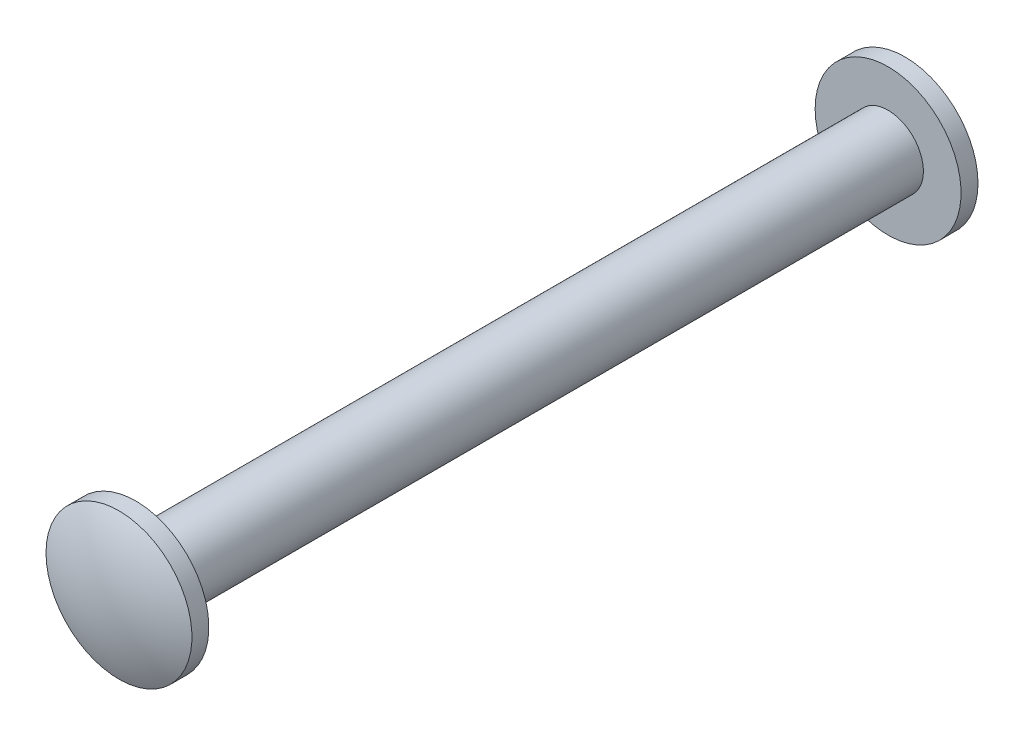
ISO-10303-21;
HEADER;
FILE_DESCRIPTION(('STEP AP214'),'2;1');
FILE_NAME('part.step','',(''),(''),'','','');
FILE_SCHEMA(('AUTOMOTIVE_DESIGN { 1 0 10303 214 1 1 1 1 }'));
ENDSEC;
DATA;
#1=APPLICATION_CONTEXT('core data for automotive mechanical design processes');
#2=APPLICATION_PROTOCOL_DEFINITION('international standard','automotive_design',2000,#1);
#3=PRODUCT_CONTEXT('',#1,'mechanical');
#4=PRODUCT('Part','Part','',(#3));
#5=PRODUCT_RELATED_PRODUCT_CATEGORY('part','',(#4));
#6=PRODUCT_DEFINITION_FORMATION('','',#4);
#7=PRODUCT_DEFINITION_CONTEXT('part definition',#1,'design');
#8=PRODUCT_DEFINITION('design','',#6,#7);
#9=PRODUCT_DEFINITION_SHAPE('','',#8);
#10=(LENGTH_UNIT() NAMED_UNIT(*) SI_UNIT(.MILLI.,.METRE.));
#11=(NAMED_UNIT(*) PLANE_ANGLE_UNIT() SI_UNIT($,.RADIAN.));
#12=(NAMED_UNIT(*) SI_UNIT($,.STERADIAN.) SOLID_ANGLE_UNIT());
#13=UNCERTAINTY_MEASURE_WITH_UNIT(LENGTH_MEASURE(1.E-05),#10,'distance_accuracy_value','');
#14=(GEOMETRIC_REPRESENTATION_CONTEXT(3) GLOBAL_UNCERTAINTY_ASSIGNED_CONTEXT((#13)) GLOBAL_UNIT_ASSIGNED_CONTEXT((#10,
#11,#12)) REPRESENTATION_CONTEXT('',''));
#15=CARTESIAN_POINT('',(0.,0.,0.));
#16=DIRECTION('',(0.,0.,1.));
#17=DIRECTION('',(1.,0.,0.));
#18=AXIS2_PLACEMENT_3D('',#15,#16,#17);
#19=CARTESIAN_POINT('',(0.,0.,-8.24639222222224));
#20=DIRECTION('',(0.,0.,-1.));
#21=DIRECTION('',(1.,0.,0.));
#22=AXIS2_PLACEMENT_3D('',#19,#20,#21);
#23=SPHERICAL_SURFACE('',#22,5.59660777777776);
#24=CARTESIAN_POINT('',(0.,0.,-13.2715));
#25=DIRECTION('',(0.,0.,-1.));
#26=DIRECTION('',(-1.,0.,0.));
#27=AXIS2_PLACEMENT_3D('',#24,#25,#26);
#28=CIRCLE('',#27,2.4638);
#29=CARTESIAN_POINT('',(-2.4638,0.,-13.2715));
#30=VERTEX_POINT('',#29);
#31=EDGE_CURVE('E54',#30,#30,#28,.T.);
#32=ORIENTED_EDGE('',*,*,#31,.T.);
#33=EDGE_LOOP('',(#32));
#34=FACE_BOUND('',#33,.T.);
#35=ADVANCED_FACE('F32',(#34),#23,.T.);
#36=CARTESIAN_POINT('',(0.,0.,8.24639222222224));
#37=DIRECTION('',(0.,0.,-1.));
#38=DIRECTION('',(-1.,0.,0.));
#39=AXIS2_PLACEMENT_3D('',#36,#37,#38);
#40=SPHERICAL_SURFACE('',#39,5.59660777777776);
#41=CARTESIAN_POINT('',(0.,0.,13.2715));
#42=DIRECTION('',(0.,0.,-1.));
#43=DIRECTION('',(-1.,0.,0.));
#44=AXIS2_PLACEMENT_3D('',#41,#42,#43);
#45=CIRCLE('',#44,2.46380000000001);
#46=CARTESIAN_POINT('',(-2.4638,0.,13.2715));
#47=VERTEX_POINT('',#46);
#48=EDGE_CURVE('E10',#47,#47,#45,.T.);
#49=ORIENTED_EDGE('',*,*,#48,.F.);
#50=EDGE_LOOP('',(#49));
#51=FACE_BOUND('',#50,.T.);
#52=ADVANCED_FACE('F71',(#51),#40,.T.);
#53=CARTESIAN_POINT('',(0.,0.,-13.843));
#54=DIRECTION('',(0.,0.,-1.));
#55=DIRECTION('',(-1.,0.,0.));
#56=AXIS2_PLACEMENT_3D('',#53,#54,#55);
#57=CYLINDRICAL_SURFACE('',#56,2.4638);
#58=ORIENTED_EDGE('',*,*,#48,.T.);
#59=EDGE_LOOP('',(#58));
#60=FACE_BOUND('',#59,.T.);
#61=CARTESIAN_POINT('',(0.,0.,12.7));
#62=DIRECTION('',(0.,0.,-1.));
#63=DIRECTION('',(-1.,0.,0.));
#64=AXIS2_PLACEMENT_3D('',#61,#62,#63);
#65=CIRCLE('',#64,2.4638);
#66=CARTESIAN_POINT('',(-2.4638,0.,12.7));
#67=VERTEX_POINT('',#66);
#68=EDGE_CURVE('E38',#67,#67,#65,.T.);
#69=ORIENTED_EDGE('',*,*,#68,.F.);
#70=EDGE_LOOP('',(#69));
#71=FACE_BOUND('',#70,.T.);
#72=ADVANCED_FACE('F75',(#60,#71),#57,.T.);
#73=CARTESIAN_POINT('',(-1.190625,0.,12.7));
#74=DIRECTION('',(0.,0.,-1.));
#75=DIRECTION('',(-1.,0.,0.));
#76=AXIS2_PLACEMENT_3D('',#73,#74,#75);
#77=PLANE('',#76);
#78=ORIENTED_EDGE('',*,*,#68,.T.);
#79=EDGE_LOOP('',(#78));
#80=FACE_BOUND('',#79,.T.);
#81=CARTESIAN_POINT('',(0.,0.,12.7));
#82=DIRECTION('',(0.,0.,-1.));
#83=DIRECTION('',(-1.,0.,0.));
#84=AXIS2_PLACEMENT_3D('',#81,#82,#83);
#85=CIRCLE('',#84,1.190625);
#86=CARTESIAN_POINT('',(-1.190625,0.,12.7));
#87=VERTEX_POINT('',#86);
#88=EDGE_CURVE('E42',#87,#87,#85,.T.);
#89=ORIENTED_EDGE('',*,*,#88,.F.);
#90=EDGE_LOOP('',(#89));
#91=FACE_BOUND('',#90,.T.);
#92=ADVANCED_FACE('F80',(#80,#91),#77,.T.);
#93=CARTESIAN_POINT('',(0.,0.,-13.843));
#94=DIRECTION('',(0.,0.,-1.));
#95=DIRECTION('',(-1.,0.,0.));
#96=AXIS2_PLACEMENT_3D('',#93,#94,#95);
#97=CYLINDRICAL_SURFACE('',#96,1.190625);
#98=ORIENTED_EDGE('',*,*,#88,.T.);
#99=EDGE_LOOP('',(#98));
#100=FACE_BOUND('',#99,.T.);
#101=CARTESIAN_POINT('',(0.,0.,-12.7));
#102=DIRECTION('',(0.,0.,-1.));
#103=DIRECTION('',(-1.,0.,0.));
#104=AXIS2_PLACEMENT_3D('',#101,#102,#103);
#105=CIRCLE('',#104,1.190625);
#106=CARTESIAN_POINT('',(-1.190625,0.,-12.7));
#107=VERTEX_POINT('',#106);
#108=EDGE_CURVE('E46',#107,#107,#105,.T.);
#109=ORIENTED_EDGE('',*,*,#108,.F.);
#110=EDGE_LOOP('',(#109));
#111=FACE_BOUND('',#110,.T.);
#112=ADVANCED_FACE('F67',(#100,#111),#97,.T.);
#113=CARTESIAN_POINT('',(-2.4638,0.,-12.7));
#114=DIRECTION('',(0.,0.,1.));
#115=DIRECTION('',(1.,0.,0.));
#116=AXIS2_PLACEMENT_3D('',#113,#114,#115);
#117=PLANE('',#116);
#118=ORIENTED_EDGE('',*,*,#108,.T.);
#119=EDGE_LOOP('',(#118));
#120=FACE_BOUND('',#119,.T.);
#121=CARTESIAN_POINT('',(0.,0.,-12.7));
#122=DIRECTION('',(0.,0.,-1.));
#123=DIRECTION('',(-1.,0.,0.));
#124=AXIS2_PLACEMENT_3D('',#121,#122,#123);
#125=CIRCLE('',#124,2.4638);
#126=CARTESIAN_POINT('',(-2.4638,0.,-12.7));
#127=VERTEX_POINT('',#126);
#128=EDGE_CURVE('E51',#127,#127,#125,.T.);
#129=ORIENTED_EDGE('',*,*,#128,.F.);
#130=EDGE_LOOP('',(#129));
#131=FACE_BOUND('',#130,.T.);
#132=ADVANCED_FACE('F61',(#120,#131),#117,.T.);
#133=CARTESIAN_POINT('',(0.,0.,-13.843));
#134=DIRECTION('',(0.,0.,-1.));
#135=DIRECTION('',(-1.,0.,0.));
#136=AXIS2_PLACEMENT_3D('',#133,#134,#135);
#137=CYLINDRICAL_SURFACE('',#136,2.4638);
#138=ORIENTED_EDGE('',*,*,#128,.T.);
#139=EDGE_LOOP('',(#138));
#140=FACE_BOUND('',#139,.T.);
#141=ORIENTED_EDGE('',*,*,#31,.F.);
#142=EDGE_LOOP('',(#141));
#143=FACE_BOUND('',#142,.T.);
#144=ADVANCED_FACE('F59',(#140,#143),#137,.T.);
#145=CLOSED_SHELL('',(#35,#52,#72,#92,#112,#132,#144));
#146=MANIFOLD_SOLID_BREP('B2',#145);
#147=ADVANCED_BREP_SHAPE_REPRESENTATION('',(#18,#146),#14);
#148=SHAPE_DEFINITION_REPRESENTATION(#9,#147);
ENDSEC;
END-ISO-10303-21;
